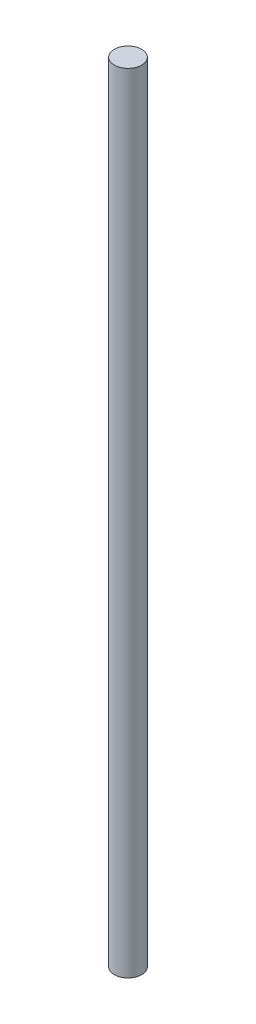
ISO-10303-21;
HEADER;
FILE_DESCRIPTION(('STEP AP214'),'2;1');
FILE_NAME('part.step','',(''),(''),'','','');
FILE_SCHEMA(('AUTOMOTIVE_DESIGN { 1 0 10303 214 1 1 1 1 }'));
ENDSEC;
DATA;
#1=APPLICATION_CONTEXT('core data for automotive mechanical design processes');
#2=APPLICATION_PROTOCOL_DEFINITION('international standard','automotive_design',2000,#1);
#3=PRODUCT_CONTEXT('',#1,'mechanical');
#4=PRODUCT('Part','Part','',(#3));
#5=PRODUCT_RELATED_PRODUCT_CATEGORY('part','',(#4));
#6=PRODUCT_DEFINITION_FORMATION('','',#4);
#7=PRODUCT_DEFINITION_CONTEXT('part definition',#1,'design');
#8=PRODUCT_DEFINITION('design','',#6,#7);
#9=PRODUCT_DEFINITION_SHAPE('','',#8);
#10=(LENGTH_UNIT() NAMED_UNIT(*) SI_UNIT(.MILLI.,.METRE.));
#11=(NAMED_UNIT(*) PLANE_ANGLE_UNIT() SI_UNIT($,.RADIAN.));
#12=(NAMED_UNIT(*) SI_UNIT($,.STERADIAN.) SOLID_ANGLE_UNIT());
#13=UNCERTAINTY_MEASURE_WITH_UNIT(LENGTH_MEASURE(1.E-05),#10,'distance_accuracy_value','');
#14=(GEOMETRIC_REPRESENTATION_CONTEXT(3) GLOBAL_UNCERTAINTY_ASSIGNED_CONTEXT((#13)) GLOBAL_UNIT_ASSIGNED_CONTEXT((#10,
#11,#12)) REPRESENTATION_CONTEXT('',''));
#15=CARTESIAN_POINT('',(0.,0.,0.));
#16=DIRECTION('',(0.,0.,1.));
#17=DIRECTION('',(1.,0.,0.));
#18=AXIS2_PLACEMENT_3D('',#15,#16,#17);
#19=CARTESIAN_POINT('',(0.,230.,0.));
#20=DIRECTION('',(0.,-1.,0.));
#21=DIRECTION('',(0.,0.,-1.));
#22=AXIS2_PLACEMENT_3D('',#19,#20,#21);
#23=CYLINDRICAL_SURFACE('',#22,4.);
#24=CARTESIAN_POINT('',(0.,230.,0.));
#25=DIRECTION('',(0.,1.,0.));
#26=DIRECTION('',(0.,0.,1.));
#27=AXIS2_PLACEMENT_3D('',#24,#25,#26);
#28=CIRCLE('',#27,4.);
#29=CARTESIAN_POINT('',(0.,230.,4.));
#30=VERTEX_POINT('',#29);
#31=EDGE_CURVE('E10',#30,#30,#28,.T.);
#32=ORIENTED_EDGE('',*,*,#31,.F.);
#33=EDGE_LOOP('',(#32));
#34=FACE_BOUND('',#33,.T.);
#35=CARTESIAN_POINT('',(0.,0.,0.));
#36=DIRECTION('',(0.,1.,0.));
#37=DIRECTION('',(0.,0.,1.));
#38=AXIS2_PLACEMENT_3D('',#35,#36,#37);
#39=CIRCLE('',#38,4.);
#40=CARTESIAN_POINT('',(0.,0.,4.));
#41=VERTEX_POINT('',#40);
#42=EDGE_CURVE('E40',#41,#41,#39,.T.);
#43=ORIENTED_EDGE('',*,*,#42,.T.);
#44=EDGE_LOOP('',(#43));
#45=FACE_BOUND('',#44,.T.);
#46=ADVANCED_FACE('F37',(#34,#45),#23,.T.);
#47=CARTESIAN_POINT('',(0.,230.,0.));
#48=DIRECTION('',(0.,1.,0.));
#49=DIRECTION('',(0.,0.,1.));
#50=AXIS2_PLACEMENT_3D('',#47,#48,#49);
#51=PLANE('',#50);
#52=ORIENTED_EDGE('',*,*,#31,.T.);
#53=EDGE_LOOP('',(#52));
#54=FACE_BOUND('',#53,.T.);
#55=ADVANCED_FACE('F54',(#54),#51,.T.);
#56=CARTESIAN_POINT('',(0.,0.,0.));
#57=DIRECTION('',(0.,1.,0.));
#58=DIRECTION('',(0.,0.,1.));
#59=AXIS2_PLACEMENT_3D('',#56,#57,#58);
#60=PLANE('',#59);
#61=ORIENTED_EDGE('',*,*,#42,.F.);
#62=EDGE_LOOP('',(#61));
#63=FACE_BOUND('',#62,.T.);
#64=ADVANCED_FACE('F52',(#63),#60,.F.);
#65=CLOSED_SHELL('',(#46,#55,#64));
#66=MANIFOLD_SOLID_BREP('B2',#65);
#67=ADVANCED_BREP_SHAPE_REPRESENTATION('',(#18,#66),#14);
#68=SHAPE_DEFINITION_REPRESENTATION(#9,#67);
ENDSEC;
END-ISO-10303-21;
